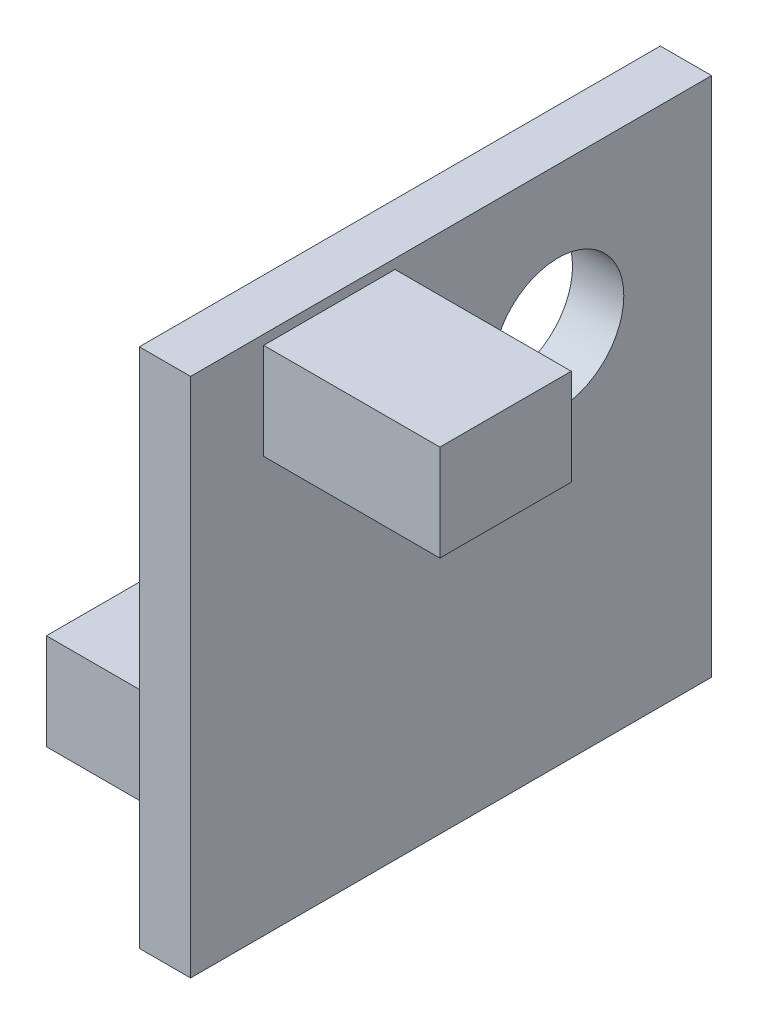
ISO-10303-21;
HEADER;
FILE_DESCRIPTION(('STEP AP214'),'2;1');
FILE_NAME('part.step','',(''),(''),'','','');
FILE_SCHEMA(('AUTOMOTIVE_DESIGN { 1 0 10303 214 1 1 1 1 }'));
ENDSEC;
DATA;
#1=APPLICATION_CONTEXT('core data for automotive mechanical design processes');
#2=APPLICATION_PROTOCOL_DEFINITION('international standard','automotive_design',2000,#1);
#3=PRODUCT_CONTEXT('',#1,'mechanical');
#4=PRODUCT('Part','Part','',(#3));
#5=PRODUCT_RELATED_PRODUCT_CATEGORY('part','',(#4));
#6=PRODUCT_DEFINITION_FORMATION('','',#4);
#7=PRODUCT_DEFINITION_CONTEXT('part definition',#1,'design');
#8=PRODUCT_DEFINITION('design','',#6,#7);
#9=PRODUCT_DEFINITION_SHAPE('','',#8);
#10=(LENGTH_UNIT() NAMED_UNIT(*) SI_UNIT(.MILLI.,.METRE.));
#11=(NAMED_UNIT(*) PLANE_ANGLE_UNIT() SI_UNIT($,.RADIAN.));
#12=(NAMED_UNIT(*) SI_UNIT($,.STERADIAN.) SOLID_ANGLE_UNIT());
#13=UNCERTAINTY_MEASURE_WITH_UNIT(LENGTH_MEASURE(1.E-05),#10,'distance_accuracy_value','');
#14=(GEOMETRIC_REPRESENTATION_CONTEXT(3) GLOBAL_UNCERTAINTY_ASSIGNED_CONTEXT((#13)) GLOBAL_UNIT_ASSIGNED_CONTEXT((#10,
#11,#12)) REPRESENTATION_CONTEXT('',''));
#15=CARTESIAN_POINT('',(0.,0.,0.));
#16=DIRECTION('',(0.,0.,1.));
#17=DIRECTION('',(1.,0.,0.));
#18=AXIS2_PLACEMENT_3D('',#15,#16,#17);
#19=CARTESIAN_POINT('',(1.6,0.,-16.26));
#20=DIRECTION('',(0.,0.,-1.));
#21=DIRECTION('',(0.,1.,0.));
#22=AXIS2_PLACEMENT_3D('',#19,#20,#21);
#23=PLANE('',#22);
#24=DIRECTION('',(0.,-1.,0.));
#25=VECTOR('',#24,1.);
#26=CARTESIAN_POINT('',(0.,0.,-16.26));
#27=LINE('',#26,#25);
#28=CARTESIAN_POINT('',(0.,0.,-16.26));
#29=VERTEX_POINT('',#28);
#30=CARTESIAN_POINT('',(0.,-16.26,-16.26));
#31=VERTEX_POINT('',#30);
#32=EDGE_CURVE('E219',#29,#31,#27,.T.);
#33=ORIENTED_EDGE('',*,*,#32,.F.);
#34=DIRECTION('',(-1.,0.,0.));
#35=VECTOR('',#34,1.);
#36=CARTESIAN_POINT('',(1.6,0.,-16.26));
#37=LINE('',#36,#35);
#38=CARTESIAN_POINT('',(1.6,0.,-16.26));
#39=VERTEX_POINT('',#38);
#40=EDGE_CURVE('E258',#39,#29,#37,.T.);
#41=ORIENTED_EDGE('',*,*,#40,.F.);
#42=DIRECTION('',(0.,-1.,0.));
#43=VECTOR('',#42,1.);
#44=CARTESIAN_POINT('',(1.6,0.,-16.26));
#45=LINE('',#44,#43);
#46=CARTESIAN_POINT('',(1.6,-16.26,-16.26));
#47=VERTEX_POINT('',#46);
#48=EDGE_CURVE('E220',#39,#47,#45,.T.);
#49=ORIENTED_EDGE('',*,*,#48,.T.);
#50=DIRECTION('',(-1.,0.,0.));
#51=VECTOR('',#50,1.);
#52=CARTESIAN_POINT('',(1.6,-16.26,-16.26));
#53=LINE('',#52,#51);
#54=EDGE_CURVE('E235',#47,#31,#53,.T.);
#55=ORIENTED_EDGE('',*,*,#54,.T.);
#56=EDGE_LOOP('',(#33,#41,#49,#55));
#57=FACE_BOUND('',#56,.T.);
#58=ADVANCED_FACE('F41',(#57),#23,.T.);
#59=CARTESIAN_POINT('',(1.6,0.,0.));
#60=DIRECTION('',(0.,1.,0.));
#61=DIRECTION('',(0.,0.,1.));
#62=AXIS2_PLACEMENT_3D('',#59,#60,#61);
#63=PLANE('',#62);
#64=DIRECTION('',(0.,0.,-1.));
#65=VECTOR('',#64,1.);
#66=CARTESIAN_POINT('',(0.,0.,0.));
#67=LINE('',#66,#65);
#68=CARTESIAN_POINT('',(0.,0.,0.));
#69=VERTEX_POINT('',#68);
#70=EDGE_CURVE('E239',#69,#29,#67,.T.);
#71=ORIENTED_EDGE('',*,*,#70,.F.);
#72=DIRECTION('',(-1.,0.,0.));
#73=VECTOR('',#72,1.);
#74=CARTESIAN_POINT('',(1.6,0.,0.));
#75=LINE('',#74,#73);
#76=CARTESIAN_POINT('',(1.6,0.,0.));
#77=VERTEX_POINT('',#76);
#78=EDGE_CURVE('E255',#77,#69,#75,.T.);
#79=ORIENTED_EDGE('',*,*,#78,.F.);
#80=DIRECTION('',(0.,0.,-1.));
#81=VECTOR('',#80,1.);
#82=CARTESIAN_POINT('',(1.6,0.,0.));
#83=LINE('',#82,#81);
#84=EDGE_CURVE('E224',#77,#39,#83,.T.);
#85=ORIENTED_EDGE('',*,*,#84,.T.);
#86=ORIENTED_EDGE('',*,*,#40,.T.);
#87=EDGE_LOOP('',(#71,#79,#85,#86));
#88=FACE_BOUND('',#87,.T.);
#89=ADVANCED_FACE('F284',(#88),#63,.T.);
#90=CARTESIAN_POINT('',(1.6,0.,0.));
#91=DIRECTION('',(0.,0.,-1.));
#92=DIRECTION('',(0.,1.,0.));
#93=AXIS2_PLACEMENT_3D('',#90,#91,#92);
#94=PLANE('',#93);
#95=DIRECTION('',(0.,-1.,0.));
#96=VECTOR('',#95,1.);
#97=CARTESIAN_POINT('',(0.,0.,0.));
#98=LINE('',#97,#96);
#99=CARTESIAN_POINT('',(0.,-16.26,0.));
#100=VERTEX_POINT('',#99);
#101=EDGE_CURVE('E243',#69,#100,#98,.T.);
#102=ORIENTED_EDGE('',*,*,#101,.T.);
#103=DIRECTION('',(-1.,0.,0.));
#104=VECTOR('',#103,1.);
#105=CARTESIAN_POINT('',(1.6,-16.26,0.));
#106=LINE('',#105,#104);
#107=CARTESIAN_POINT('',(1.6,-16.26,0.));
#108=VERTEX_POINT('',#107);
#109=EDGE_CURVE('E251',#108,#100,#106,.T.);
#110=ORIENTED_EDGE('',*,*,#109,.F.);
#111=DIRECTION('',(0.,-1.,0.));
#112=VECTOR('',#111,1.);
#113=CARTESIAN_POINT('',(1.6,0.,0.));
#114=LINE('',#113,#112);
#115=EDGE_CURVE('E229',#77,#108,#114,.T.);
#116=ORIENTED_EDGE('',*,*,#115,.F.);
#117=ORIENTED_EDGE('',*,*,#78,.T.);
#118=EDGE_LOOP('',(#102,#110,#116,#117));
#119=FACE_BOUND('',#118,.T.);
#120=ADVANCED_FACE('F289',(#119),#94,.F.);
#121=CARTESIAN_POINT('',(1.6,-16.26,0.));
#122=DIRECTION('',(0.,1.,0.));
#123=DIRECTION('',(0.,0.,1.));
#124=AXIS2_PLACEMENT_3D('',#121,#122,#123);
#125=PLANE('',#124);
#126=DIRECTION('',(0.,0.,-1.));
#127=VECTOR('',#126,1.);
#128=CARTESIAN_POINT('',(0.,-16.26,0.));
#129=LINE('',#128,#127);
#130=EDGE_CURVE('E225',#100,#31,#129,.T.);
#131=ORIENTED_EDGE('',*,*,#130,.T.);
#132=ORIENTED_EDGE('',*,*,#54,.F.);
#133=DIRECTION('',(0.,0.,-1.));
#134=VECTOR('',#133,1.);
#135=CARTESIAN_POINT('',(1.6,-16.26,0.));
#136=LINE('',#135,#134);
#137=EDGE_CURVE('E232',#108,#47,#136,.T.);
#138=ORIENTED_EDGE('',*,*,#137,.F.);
#139=ORIENTED_EDGE('',*,*,#109,.T.);
#140=EDGE_LOOP('',(#131,#132,#138,#139));
#141=FACE_BOUND('',#140,.T.);
#142=ADVANCED_FACE('F305',(#141),#125,.F.);
#143=CARTESIAN_POINT('',(1.6,0.,0.));
#144=DIRECTION('',(1.,0.,0.));
#145=DIRECTION('',(0.,0.,-1.));
#146=AXIS2_PLACEMENT_3D('',#143,#144,#145);
#147=PLANE('',#146);
#148=CARTESIAN_POINT('',(1.6,-4.58,-11.47));
#149=DIRECTION('',(1.,0.,0.));
#150=DIRECTION('',(0.,0.,-1.));
#151=AXIS2_PLACEMENT_3D('',#148,#149,#150);
#152=CIRCLE('',#151,2.05);
#153=CARTESIAN_POINT('',(1.6,-4.58,-13.52));
#154=VERTEX_POINT('',#153);
#155=EDGE_CURVE('E163',#154,#154,#152,.T.);
#156=ORIENTED_EDGE('',*,*,#155,.F.);
#157=EDGE_LOOP('',(#156));
#158=FACE_BOUND('',#157,.T.);
#159=DIRECTION('',(0.,1.,0.));
#160=VECTOR('',#159,1.);
#161=CARTESIAN_POINT('',(1.6,0.,-6.38));
#162=LINE('',#161,#160);
#163=CARTESIAN_POINT('',(1.6,-3.3,-6.38));
#164=VERTEX_POINT('',#163);
#165=CARTESIAN_POINT('',(1.6,-0.3,-6.38));
#166=VERTEX_POINT('',#165);
#167=EDGE_CURVE('E216',#164,#166,#162,.T.);
#168=ORIENTED_EDGE('',*,*,#167,.F.);
#169=DIRECTION('',(0.,0.,1.));
#170=VECTOR('',#169,1.);
#171=CARTESIAN_POINT('',(1.6,-3.3,0.));
#172=LINE('',#171,#170);
#173=CARTESIAN_POINT('',(1.6,-3.3,-2.28));
#174=VERTEX_POINT('',#173);
#175=EDGE_CURVE('E205',#164,#174,#172,.T.);
#176=ORIENTED_EDGE('',*,*,#175,.T.);
#177=DIRECTION('',(0.,1.,0.));
#178=VECTOR('',#177,1.);
#179=CARTESIAN_POINT('',(1.6,0.,-2.28));
#180=LINE('',#179,#178);
#181=CARTESIAN_POINT('',(1.6,-0.3,-2.28));
#182=VERTEX_POINT('',#181);
#183=EDGE_CURVE('E209',#174,#182,#180,.T.);
#184=ORIENTED_EDGE('',*,*,#183,.T.);
#185=DIRECTION('',(0.,0.,1.));
#186=VECTOR('',#185,1.);
#187=CARTESIAN_POINT('',(1.6,-0.3,0.));
#188=LINE('',#187,#186);
#189=EDGE_CURVE('E213',#166,#182,#188,.T.);
#190=ORIENTED_EDGE('',*,*,#189,.F.);
#191=EDGE_LOOP('',(#168,#176,#184,#190));
#192=FACE_BOUND('',#191,.T.);
#193=ORIENTED_EDGE('',*,*,#48,.F.);
#194=ORIENTED_EDGE('',*,*,#84,.F.);
#195=ORIENTED_EDGE('',*,*,#115,.T.);
#196=ORIENTED_EDGE('',*,*,#137,.T.);
#197=EDGE_LOOP('',(#193,#194,#195,#196));
#198=FACE_BOUND('',#197,.T.);
#199=ADVANCED_FACE('F301',(#158,#192,#198),#147,.T.);
#200=CARTESIAN_POINT('',(0.,0.,0.));
#201=DIRECTION('',(1.,0.,0.));
#202=DIRECTION('',(0.,0.,-1.));
#203=AXIS2_PLACEMENT_3D('',#200,#201,#202);
#204=PLANE('',#203);
#205=DIRECTION('',(0.,0.,1.));
#206=VECTOR('',#205,1.);
#207=CARTESIAN_POINT('',(0.,-11.26,0.));
#208=LINE('',#207,#206);
#209=CARTESIAN_POINT('',(0.,-11.26,-9.5));
#210=VERTEX_POINT('',#209);
#211=CARTESIAN_POINT('',(0.,-11.26,-2.));
#212=VERTEX_POINT('',#211);
#213=EDGE_CURVE('E49',#210,#212,#208,.T.);
#214=ORIENTED_EDGE('',*,*,#213,.T.);
#215=DIRECTION('',(0.,-1.,0.));
#216=VECTOR('',#215,1.);
#217=CARTESIAN_POINT('',(0.,0.,-2.));
#218=LINE('',#217,#216);
#219=CARTESIAN_POINT('',(0.,-14.26,-2.));
#220=VERTEX_POINT('',#219);
#221=EDGE_CURVE('E11',#212,#220,#218,.T.);
#222=ORIENTED_EDGE('',*,*,#221,.T.);
#223=DIRECTION('',(0.,0.,-1.));
#224=VECTOR('',#223,1.);
#225=CARTESIAN_POINT('',(0.,-14.26,0.));
#226=LINE('',#225,#224);
#227=CARTESIAN_POINT('',(0.,-14.26,-9.5));
#228=VERTEX_POINT('',#227);
#229=EDGE_CURVE('E134',#220,#228,#226,.T.);
#230=ORIENTED_EDGE('',*,*,#229,.T.);
#231=DIRECTION('',(0.,1.,0.));
#232=VECTOR('',#231,1.);
#233=CARTESIAN_POINT('',(0.,0.,-9.5));
#234=LINE('',#233,#232);
#235=EDGE_CURVE('E263',#228,#210,#234,.T.);
#236=ORIENTED_EDGE('',*,*,#235,.T.);
#237=EDGE_LOOP('',(#214,#222,#230,#236));
#238=FACE_BOUND('',#237,.T.);
#239=CARTESIAN_POINT('',(0.,-4.58,-11.47));
#240=DIRECTION('',(1.,0.,0.));
#241=DIRECTION('',(0.,0.,-1.));
#242=AXIS2_PLACEMENT_3D('',#239,#240,#241);
#243=CIRCLE('',#242,2.05);
#244=CARTESIAN_POINT('',(0.,-4.58,-13.52));
#245=VERTEX_POINT('',#244);
#246=EDGE_CURVE('E170',#245,#245,#243,.T.);
#247=ORIENTED_EDGE('',*,*,#246,.T.);
#248=EDGE_LOOP('',(#247));
#249=FACE_BOUND('',#248,.T.);
#250=ORIENTED_EDGE('',*,*,#32,.T.);
#251=ORIENTED_EDGE('',*,*,#130,.F.);
#252=ORIENTED_EDGE('',*,*,#101,.F.);
#253=ORIENTED_EDGE('',*,*,#70,.T.);
#254=EDGE_LOOP('',(#250,#251,#252,#253));
#255=FACE_BOUND('',#254,.T.);
#256=ADVANCED_FACE('F269',(#238,#249,#255),#204,.F.);
#257=CARTESIAN_POINT('',(7.1,0.,-6.38));
#258=DIRECTION('',(0.,0.,-1.));
#259=DIRECTION('',(-1.,0.,0.));
#260=AXIS2_PLACEMENT_3D('',#257,#258,#259);
#261=PLANE('',#260);
#262=DIRECTION('',(-1.,0.,0.));
#263=VECTOR('',#262,1.);
#264=CARTESIAN_POINT('',(7.1,-3.3,-6.38));
#265=LINE('',#264,#263);
#266=CARTESIAN_POINT('',(7.1,-3.3,-6.38));
#267=VERTEX_POINT('',#266);
#268=EDGE_CURVE('E191',#267,#164,#265,.T.);
#269=ORIENTED_EDGE('',*,*,#268,.T.);
#270=ORIENTED_EDGE('',*,*,#167,.T.);
#271=DIRECTION('',(-1.,0.,0.));
#272=VECTOR('',#271,1.);
#273=CARTESIAN_POINT('',(7.1,-0.3,-6.38));
#274=LINE('',#273,#272);
#275=CARTESIAN_POINT('',(7.1,-0.3,-6.38));
#276=VERTEX_POINT('',#275);
#277=EDGE_CURVE('E201',#276,#166,#274,.T.);
#278=ORIENTED_EDGE('',*,*,#277,.F.);
#279=DIRECTION('',(0.,-1.,0.));
#280=VECTOR('',#279,1.);
#281=CARTESIAN_POINT('',(7.1,0.,-6.38));
#282=LINE('',#281,#280);
#283=EDGE_CURVE('E174',#276,#267,#282,.T.);
#284=ORIENTED_EDGE('',*,*,#283,.T.);
#285=EDGE_LOOP('',(#269,#270,#278,#284));
#286=FACE_BOUND('',#285,.T.);
#287=ADVANCED_FACE('F316',(#286),#261,.T.);
#288=CARTESIAN_POINT('',(7.1,-0.3,0.));
#289=DIRECTION('',(0.,1.,0.));
#290=DIRECTION('',(0.,0.,1.));
#291=AXIS2_PLACEMENT_3D('',#288,#289,#290);
#292=PLANE('',#291);
#293=ORIENTED_EDGE('',*,*,#277,.T.);
#294=ORIENTED_EDGE('',*,*,#189,.T.);
#295=DIRECTION('',(-1.,0.,0.));
#296=VECTOR('',#295,1.);
#297=CARTESIAN_POINT('',(7.1,-0.3,-2.28));
#298=LINE('',#297,#296);
#299=CARTESIAN_POINT('',(7.1,-0.3,-2.28));
#300=VERTEX_POINT('',#299);
#301=EDGE_CURVE('E197',#300,#182,#298,.T.);
#302=ORIENTED_EDGE('',*,*,#301,.F.);
#303=DIRECTION('',(0.,0.,-1.));
#304=VECTOR('',#303,1.);
#305=CARTESIAN_POINT('',(7.1,-0.3,0.));
#306=LINE('',#305,#304);
#307=EDGE_CURVE('E181',#300,#276,#306,.T.);
#308=ORIENTED_EDGE('',*,*,#307,.T.);
#309=EDGE_LOOP('',(#293,#294,#302,#308));
#310=FACE_BOUND('',#309,.T.);
#311=ADVANCED_FACE('F322',(#310),#292,.T.);
#312=CARTESIAN_POINT('',(7.1,0.,-2.28));
#313=DIRECTION('',(0.,0.,-1.));
#314=DIRECTION('',(0.,1.,0.));
#315=AXIS2_PLACEMENT_3D('',#312,#313,#314);
#316=PLANE('',#315);
#317=ORIENTED_EDGE('',*,*,#183,.F.);
#318=DIRECTION('',(-1.,0.,0.));
#319=VECTOR('',#318,1.);
#320=CARTESIAN_POINT('',(7.1,-3.3,-2.28));
#321=LINE('',#320,#319);
#322=CARTESIAN_POINT('',(7.1,-3.3,-2.28));
#323=VERTEX_POINT('',#322);
#324=EDGE_CURVE('E64',#323,#174,#321,.T.);
#325=ORIENTED_EDGE('',*,*,#324,.F.);
#326=DIRECTION('',(0.,-1.,0.));
#327=VECTOR('',#326,1.);
#328=CARTESIAN_POINT('',(7.1,0.,-2.28));
#329=LINE('',#328,#327);
#330=EDGE_CURVE('E185',#300,#323,#329,.T.);
#331=ORIENTED_EDGE('',*,*,#330,.F.);
#332=ORIENTED_EDGE('',*,*,#301,.T.);
#333=EDGE_LOOP('',(#317,#325,#331,#332));
#334=FACE_BOUND('',#333,.T.);
#335=ADVANCED_FACE('F326',(#334),#316,.F.);
#336=CARTESIAN_POINT('',(7.1,-3.3,0.));
#337=DIRECTION('',(0.,1.,0.));
#338=DIRECTION('',(0.,0.,1.));
#339=AXIS2_PLACEMENT_3D('',#336,#337,#338);
#340=PLANE('',#339);
#341=ORIENTED_EDGE('',*,*,#175,.F.);
#342=ORIENTED_EDGE('',*,*,#268,.F.);
#343=DIRECTION('',(0.,0.,-1.));
#344=VECTOR('',#343,1.);
#345=CARTESIAN_POINT('',(7.1,-3.3,0.));
#346=LINE('',#345,#344);
#347=EDGE_CURVE('E188',#323,#267,#346,.T.);
#348=ORIENTED_EDGE('',*,*,#347,.F.);
#349=ORIENTED_EDGE('',*,*,#324,.T.);
#350=EDGE_LOOP('',(#341,#342,#348,#349));
#351=FACE_BOUND('',#350,.T.);
#352=ADVANCED_FACE('F330',(#351),#340,.F.);
#353=CARTESIAN_POINT('',(7.1,0.,0.));
#354=DIRECTION('',(1.,0.,0.));
#355=DIRECTION('',(0.,0.,-1.));
#356=AXIS2_PLACEMENT_3D('',#353,#354,#355);
#357=PLANE('',#356);
#358=ORIENTED_EDGE('',*,*,#283,.F.);
#359=ORIENTED_EDGE('',*,*,#307,.F.);
#360=ORIENTED_EDGE('',*,*,#330,.T.);
#361=ORIENTED_EDGE('',*,*,#347,.T.);
#362=EDGE_LOOP('',(#358,#359,#360,#361));
#363=FACE_BOUND('',#362,.T.);
#364=ADVANCED_FACE('F334',(#363),#357,.T.);
#365=CARTESIAN_POINT('',(0.,-4.58,-11.47));
#366=DIRECTION('',(1.,0.,0.));
#367=DIRECTION('',(0.,0.,-1.));
#368=AXIS2_PLACEMENT_3D('',#365,#366,#367);
#369=CYLINDRICAL_SURFACE('',#368,2.05);
#370=ORIENTED_EDGE('',*,*,#246,.F.);
#371=EDGE_LOOP('',(#370));
#372=FACE_BOUND('',#371,.T.);
#373=ORIENTED_EDGE('',*,*,#155,.T.);
#374=EDGE_LOOP('',(#373));
#375=FACE_BOUND('',#374,.T.);
#376=ADVANCED_FACE('F337',(#372,#375),#369,.F.);
#377=CARTESIAN_POINT('',(-4.9,-11.26,-2.));
#378=DIRECTION('',(0.,0.,1.));
#379=DIRECTION('',(0.,-1.,0.));
#380=AXIS2_PLACEMENT_3D('',#377,#378,#379);
#381=PLANE('',#380);
#382=ORIENTED_EDGE('',*,*,#221,.F.);
#383=DIRECTION('',(1.,0.,0.));
#384=VECTOR('',#383,1.);
#385=CARTESIAN_POINT('',(-4.9,-11.26,-2.));
#386=LINE('',#385,#384);
#387=CARTESIAN_POINT('',(-4.9,-11.26,-2.));
#388=VERTEX_POINT('',#387);
#389=EDGE_CURVE('E153',#388,#212,#386,.T.);
#390=ORIENTED_EDGE('',*,*,#389,.F.);
#391=DIRECTION('',(0.,-1.,0.));
#392=VECTOR('',#391,1.);
#393=CARTESIAN_POINT('',(-4.9,-11.26,-2.));
#394=LINE('',#393,#392);
#395=CARTESIAN_POINT('',(-4.9,-14.26,-2.));
#396=VERTEX_POINT('',#395);
#397=EDGE_CURVE('E145',#388,#396,#394,.T.);
#398=ORIENTED_EDGE('',*,*,#397,.T.);
#399=DIRECTION('',(1.,0.,0.));
#400=VECTOR('',#399,1.);
#401=CARTESIAN_POINT('',(-4.9,-14.26,-2.));
#402=LINE('',#401,#400);
#403=EDGE_CURVE('E129',#396,#220,#402,.T.);
#404=ORIENTED_EDGE('',*,*,#403,.T.);
#405=EDGE_LOOP('',(#382,#390,#398,#404));
#406=FACE_BOUND('',#405,.T.);
#407=ADVANCED_FACE('F151',(#406),#381,.T.);
#408=CARTESIAN_POINT('',(-4.9,-11.26,-2.));
#409=DIRECTION('',(0.,1.,0.));
#410=DIRECTION('',(0.,0.,1.));
#411=AXIS2_PLACEMENT_3D('',#408,#409,#410);
#412=PLANE('',#411);
#413=ORIENTED_EDGE('',*,*,#213,.F.);
#414=DIRECTION('',(1.,0.,0.));
#415=VECTOR('',#414,1.);
#416=CARTESIAN_POINT('',(-4.9,-11.26,-9.5));
#417=LINE('',#416,#415);
#418=CARTESIAN_POINT('',(-4.9,-11.26,-9.5));
#419=VERTEX_POINT('',#418);
#420=EDGE_CURVE('E164',#419,#210,#417,.T.);
#421=ORIENTED_EDGE('',*,*,#420,.F.);
#422=DIRECTION('',(0.,0.,1.));
#423=VECTOR('',#422,1.);
#424=CARTESIAN_POINT('',(-4.9,-11.26,-2.));
#425=LINE('',#424,#423);
#426=EDGE_CURVE('E138',#419,#388,#425,.T.);
#427=ORIENTED_EDGE('',*,*,#426,.T.);
#428=ORIENTED_EDGE('',*,*,#389,.T.);
#429=EDGE_LOOP('',(#413,#421,#427,#428));
#430=FACE_BOUND('',#429,.T.);
#431=ADVANCED_FACE('F272',(#430),#412,.T.);
#432=CARTESIAN_POINT('',(-4.9,-11.26,-9.5));
#433=DIRECTION('',(0.,0.,-1.));
#434=DIRECTION('',(-1.,0.,0.));
#435=AXIS2_PLACEMENT_3D('',#432,#433,#434);
#436=PLANE('',#435);
#437=ORIENTED_EDGE('',*,*,#235,.F.);
#438=DIRECTION('',(1.,0.,0.));
#439=VECTOR('',#438,1.);
#440=CARTESIAN_POINT('',(-4.9,-14.26,-9.5));
#441=LINE('',#440,#439);
#442=CARTESIAN_POINT('',(-4.9,-14.26,-9.5));
#443=VERTEX_POINT('',#442);
#444=EDGE_CURVE('E56',#443,#228,#441,.T.);
#445=ORIENTED_EDGE('',*,*,#444,.F.);
#446=DIRECTION('',(0.,1.,0.));
#447=VECTOR('',#446,1.);
#448=CARTESIAN_POINT('',(-4.9,-11.26,-9.5));
#449=LINE('',#448,#447);
#450=EDGE_CURVE('E148',#443,#419,#449,.T.);
#451=ORIENTED_EDGE('',*,*,#450,.T.);
#452=ORIENTED_EDGE('',*,*,#420,.T.);
#453=EDGE_LOOP('',(#437,#445,#451,#452));
#454=FACE_BOUND('',#453,.T.);
#455=ADVANCED_FACE('F274',(#454),#436,.T.);
#456=CARTESIAN_POINT('',(-4.9,-14.26,-2.));
#457=DIRECTION('',(0.,-1.,0.));
#458=DIRECTION('',(0.,0.,-1.));
#459=AXIS2_PLACEMENT_3D('',#456,#457,#458);
#460=PLANE('',#459);
#461=ORIENTED_EDGE('',*,*,#229,.F.);
#462=ORIENTED_EDGE('',*,*,#403,.F.);
#463=DIRECTION('',(0.,0.,-1.));
#464=VECTOR('',#463,1.);
#465=CARTESIAN_POINT('',(-4.9,-14.26,-2.));
#466=LINE('',#465,#464);
#467=EDGE_CURVE('E132',#396,#443,#466,.T.);
#468=ORIENTED_EDGE('',*,*,#467,.T.);
#469=ORIENTED_EDGE('',*,*,#444,.T.);
#470=EDGE_LOOP('',(#461,#462,#468,#469));
#471=FACE_BOUND('',#470,.T.);
#472=ADVANCED_FACE('F131',(#471),#460,.T.);
#473=CARTESIAN_POINT('',(-4.9,0.,0.));
#474=DIRECTION('',(1.,0.,0.));
#475=DIRECTION('',(0.,0.,-1.));
#476=AXIS2_PLACEMENT_3D('',#473,#474,#475);
#477=PLANE('',#476);
#478=ORIENTED_EDGE('',*,*,#397,.F.);
#479=ORIENTED_EDGE('',*,*,#426,.F.);
#480=ORIENTED_EDGE('',*,*,#450,.F.);
#481=ORIENTED_EDGE('',*,*,#467,.F.);
#482=EDGE_LOOP('',(#478,#479,#480,#481));
#483=FACE_BOUND('',#482,.T.);
#484=ADVANCED_FACE('F143',(#483),#477,.F.);
#485=CLOSED_SHELL('',(#58,#89,#120,#142,#199,#256,#287,#311,#335,#352,#364,#376,#407,#431,#455,
#472,#484));
#486=MANIFOLD_SOLID_BREP('B2',#485);
#487=ADVANCED_BREP_SHAPE_REPRESENTATION('',(#18,#486),#14);
#488=SHAPE_DEFINITION_REPRESENTATION(#9,#487);
ENDSEC;
END-ISO-10303-21;
